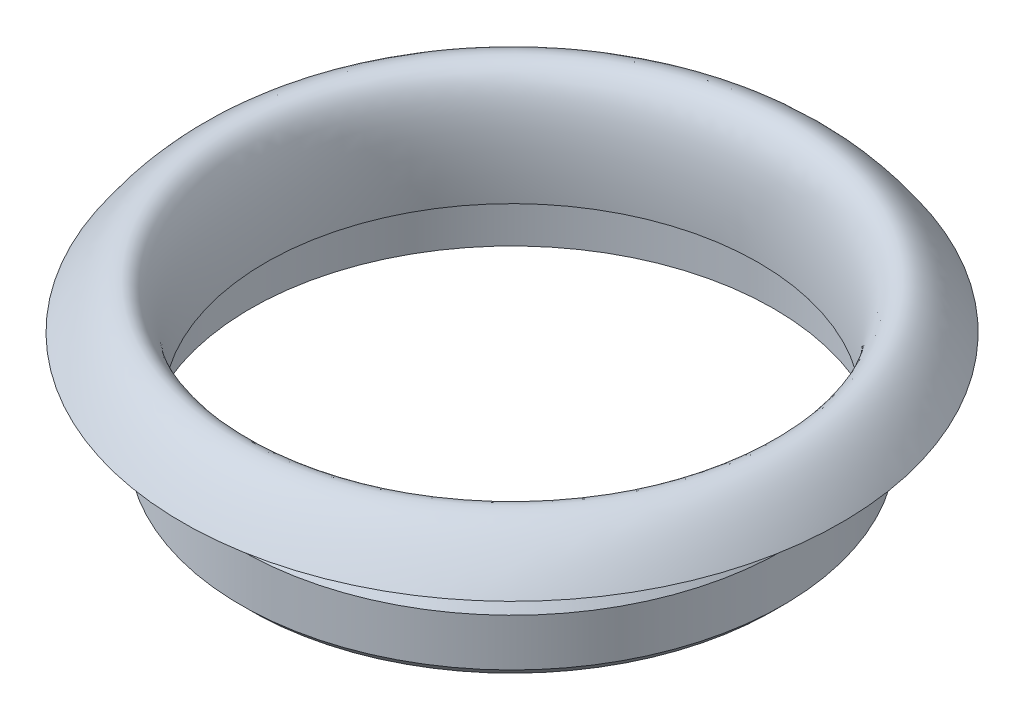
ISO-10303-21;
HEADER;
FILE_DESCRIPTION(('STEP AP214'),'2;1');
FILE_NAME('part.step','',(''),(''),'','','');
FILE_SCHEMA(('AUTOMOTIVE_DESIGN { 1 0 10303 214 1 1 1 1 }'));
ENDSEC;
DATA;
#1=APPLICATION_CONTEXT('core data for automotive mechanical design processes');
#2=APPLICATION_PROTOCOL_DEFINITION('international standard','automotive_design',2000,#1);
#3=PRODUCT_CONTEXT('',#1,'mechanical');
#4=PRODUCT('Part','Part','',(#3));
#5=PRODUCT_RELATED_PRODUCT_CATEGORY('part','',(#4));
#6=PRODUCT_DEFINITION_FORMATION('','',#4);
#7=PRODUCT_DEFINITION_CONTEXT('part definition',#1,'design');
#8=PRODUCT_DEFINITION('design','',#6,#7);
#9=PRODUCT_DEFINITION_SHAPE('','',#8);
#10=(LENGTH_UNIT() NAMED_UNIT(*) SI_UNIT(.MILLI.,.METRE.));
#11=(NAMED_UNIT(*) PLANE_ANGLE_UNIT() SI_UNIT($,.RADIAN.));
#12=(NAMED_UNIT(*) SI_UNIT($,.STERADIAN.) SOLID_ANGLE_UNIT());
#13=UNCERTAINTY_MEASURE_WITH_UNIT(LENGTH_MEASURE(1.E-05),#10,'distance_accuracy_value','');
#14=(GEOMETRIC_REPRESENTATION_CONTEXT(3) GLOBAL_UNCERTAINTY_ASSIGNED_CONTEXT((#13)) GLOBAL_UNIT_ASSIGNED_CONTEXT((#10,
#11,#12)) REPRESENTATION_CONTEXT('',''));
#15=CARTESIAN_POINT('',(0.,0.,0.));
#16=DIRECTION('',(0.,0.,1.));
#17=DIRECTION('',(1.,0.,0.));
#18=AXIS2_PLACEMENT_3D('',#15,#16,#17);
#19=CARTESIAN_POINT('',(-53.9197911218244,1.99998894248879,0.));
#20=CARTESIAN_POINT('',(-53.8973723331522,2.70253482728366,0.));
#21=CARTESIAN_POINT('',(-53.8669610528278,4.13823711393358,0.));
#22=CARTESIAN_POINT('',(-53.8719027555461,6.11175904762365,0.));
#23=CARTESIAN_POINT('',(-53.9236351386886,7.97753059977467,0.));
#24=CARTESIAN_POINT('',(-54.053631769709,10.2949520871215,0.));
#25=CARTESIAN_POINT('',(-54.3263594875917,12.8824376545672,0.));
#26=CARTESIAN_POINT('',(-54.9727004871494,16.3471177304074,0.));
#27=CARTESIAN_POINT('',(-55.8986720581001,18.770035909896,0.));
#28=CARTESIAN_POINT('',(-56.8833447435234,20.1055139825566,0.));
#29=CARTESIAN_POINT('',(-57.5434307134598,20.6165189133527,0.));
#30=CARTESIAN_POINT('',(-58.112865726207,20.8175999595448,0.));
#31=CARTESIAN_POINT('',(-58.8149639414059,20.8333481037732,0.));
#32=CARTESIAN_POINT('',(-59.8224273954332,20.5441829743244,0.));
#33=CARTESIAN_POINT('',(-61.1062671917436,19.8257080132769,0.));
#34=CARTESIAN_POINT('',(-62.5969346455263,18.6357233798375,0.));
#35=CARTESIAN_POINT('',(-64.2395644390793,16.9711555804732,0.));
#36=CARTESIAN_POINT('',(-65.711127705577,15.1844854037249,0.));
#37=CARTESIAN_POINT('',(-66.9255509224171,13.5373251129458,0.));
#38=CARTESIAN_POINT('',(-67.5646455106161,12.6102007961293,0.));
#39=CARTESIAN_POINT('',(-67.8703856300136,12.152912124841,0.));
#40=B_SPLINE_CURVE_WITH_KNOTS('',3,(#19,#20,#21,#22,#23,#24,#25,#26,#27,#28,#29,#30,#31,#32,#33,
#34,#35,#36,#37,#38,#39),.UNSPECIFIED.,.F.,.F.,(4,1,1,1,1,1,1,1,1,1,1,1,1,1,1,1,1,1,4),
(0.0260433266725054,0.0564794727139896,0.0869156187554738,0.117351764796958,0.147787910838442,
0.208660202921411,0.269532495004379,0.391277079170316,0.452149371253284,0.513021663336253,
0.573893955419221,0.63476624750219,0.695638539585158,0.756510831668126,0.817383123751095,
0.878255415834063,0.939127707917032,0.969563853958516,1.),.UNSPECIFIED.);
#41=CARTESIAN_POINT('',(0.,0.,0.));
#42=DIRECTION('',(0.,-1.,0.));
#43=AXIS1_PLACEMENT('',#41,#42);
#44=SURFACE_OF_REVOLUTION('',#40,#43);
#45=CARTESIAN_POINT('',(0.,12.152912124841,0.));
#46=DIRECTION('',(0.,-1.,0.));
#47=DIRECTION('',(0.,0.,-1.));
#48=AXIS2_PLACEMENT_3D('',#45,#46,#47);
#49=CIRCLE('',#48,67.8703856300136);
#50=CARTESIAN_POINT('',(0.,12.152912124841,-67.8703856300136));
#51=VERTEX_POINT('',#50);
#52=EDGE_CURVE('E62',#51,#51,#49,.T.);
#53=ORIENTED_EDGE('',*,*,#52,.T.);
#54=EDGE_LOOP('',(#53));
#55=FACE_BOUND('',#54,.T.);
#56=CARTESIAN_POINT('',(0.,7.32726743440723,0.));
#57=DIRECTION('',(0.,-1.,0.));
#58=DIRECTION('',(0.,0.,-1.));
#59=AXIS2_PLACEMENT_3D('',#56,#57,#58);
#60=CIRCLE('',#59,53.9082557865716);
#61=CARTESIAN_POINT('',(0.,7.32726743440723,-53.9082557865716));
#62=VERTEX_POINT('',#61);
#63=EDGE_CURVE('E10',#62,#62,#60,.T.);
#64=ORIENTED_EDGE('',*,*,#63,.F.);
#65=EDGE_LOOP('',(#64));
#66=FACE_BOUND('',#65,.T.);
#67=ADVANCED_FACE('F33',(#55,#66),#44,.F.);
#68=CARTESIAN_POINT('',(0.,1.99999999999999,0.));
#69=DIRECTION('',(0.,-1.,0.));
#70=DIRECTION('',(0.,0.,-1.));
#71=AXIS2_PLACEMENT_3D('',#68,#69,#70);
#72=CONICAL_SURFACE('',#71,57.2,0.553480884520044);
#73=ORIENTED_EDGE('',*,*,#63,.T.);
#74=EDGE_LOOP('',(#73));
#75=FACE_BOUND('',#74,.T.);
#76=CARTESIAN_POINT('',(0.,1.99999999999999,0.));
#77=DIRECTION('',(0.,-1.,0.));
#78=DIRECTION('',(0.,0.,-1.));
#79=AXIS2_PLACEMENT_3D('',#76,#77,#78);
#80=CIRCLE('',#79,57.2);
#81=CARTESIAN_POINT('',(0.,1.99999999999999,-57.2));
#82=VERTEX_POINT('',#81);
#83=EDGE_CURVE('E40',#82,#82,#80,.T.);
#84=ORIENTED_EDGE('',*,*,#83,.F.);
#85=EDGE_LOOP('',(#84));
#86=FACE_BOUND('',#85,.T.);
#87=ADVANCED_FACE('F95',(#75,#86),#72,.T.);
#88=CARTESIAN_POINT('',(0.,0.,0.));
#89=DIRECTION('',(0.,-1.,0.));
#90=DIRECTION('',(0.,0.,-1.));
#91=AXIS2_PLACEMENT_3D('',#88,#89,#90);
#92=CYLINDRICAL_SURFACE('',#91,57.2);
#93=CARTESIAN_POINT('',(0.,-7.99999999999998,0.));
#94=DIRECTION('',(0.,-1.,0.));
#95=DIRECTION('',(0.,0.,-1.));
#96=AXIS2_PLACEMENT_3D('',#93,#94,#95);
#97=CIRCLE('',#96,57.2);
#98=CARTESIAN_POINT('',(0.,-7.99999999999998,-57.2));
#99=VERTEX_POINT('',#98);
#100=EDGE_CURVE('E44',#99,#99,#97,.T.);
#101=ORIENTED_EDGE('',*,*,#100,.F.);
#102=EDGE_LOOP('',(#101));
#103=FACE_BOUND('',#102,.T.);
#104=ORIENTED_EDGE('',*,*,#83,.T.);
#105=EDGE_LOOP('',(#104));
#106=FACE_BOUND('',#105,.T.);
#107=ADVANCED_FACE('F92',(#103,#106),#92,.T.);
#108=CARTESIAN_POINT('',(0.,-10.,0.));
#109=DIRECTION('',(0.,1.,0.));
#110=DIRECTION('',(0.,0.,1.));
#111=AXIS2_PLACEMENT_3D('',#108,#109,#110);
#112=CONICAL_SURFACE('',#111,55.2,0.785398163397443);
#113=ORIENTED_EDGE('',*,*,#100,.T.);
#114=EDGE_LOOP('',(#113));
#115=FACE_BOUND('',#114,.T.);
#116=CARTESIAN_POINT('',(0.,-10.,0.));
#117=DIRECTION('',(0.,-1.,0.));
#118=DIRECTION('',(0.,0.,-1.));
#119=AXIS2_PLACEMENT_3D('',#116,#117,#118);
#120=CIRCLE('',#119,55.2);
#121=CARTESIAN_POINT('',(0.,-10.,-55.2));
#122=VERTEX_POINT('',#121);
#123=EDGE_CURVE('E48',#122,#122,#120,.T.);
#124=ORIENTED_EDGE('',*,*,#123,.F.);
#125=EDGE_LOOP('',(#124));
#126=FACE_BOUND('',#125,.T.);
#127=ADVANCED_FACE('F88',(#115,#126),#112,.T.);
#128=CARTESIAN_POINT('',(0.,0.,0.));
#129=DIRECTION('',(0.,-1.,0.));
#130=DIRECTION('',(0.,0.,-1.));
#131=AXIS2_PLACEMENT_3D('',#128,#129,#130);
#132=CYLINDRICAL_SURFACE('',#131,55.2);
#133=ORIENTED_EDGE('',*,*,#123,.T.);
#134=EDGE_LOOP('',(#133));
#135=FACE_BOUND('',#134,.T.);
#136=CARTESIAN_POINT('',(0.,0.,0.));
#137=DIRECTION('',(0.,-1.,0.));
#138=DIRECTION('',(0.,0.,-1.));
#139=AXIS2_PLACEMENT_3D('',#136,#137,#138);
#140=CIRCLE('',#139,55.2);
#141=CARTESIAN_POINT('',(0.,0.,-55.2));
#142=VERTEX_POINT('',#141);
#143=EDGE_CURVE('E53',#142,#142,#140,.T.);
#144=ORIENTED_EDGE('',*,*,#143,.F.);
#145=EDGE_LOOP('',(#144));
#146=FACE_BOUND('',#145,.T.);
#147=ADVANCED_FACE('F84',(#135,#146),#132,.F.);
#148=CARTESIAN_POINT('',(0.,0.,0.));
#149=DIRECTION('',(0.,-1.,0.));
#150=DIRECTION('',(0.,0.,-1.));
#151=AXIS2_PLACEMENT_3D('',#148,#149,#150);
#152=PLANE('',#151);
#153=ORIENTED_EDGE('',*,*,#143,.T.);
#154=EDGE_LOOP('',(#153));
#155=FACE_BOUND('',#154,.T.);
#156=CARTESIAN_POINT('',(0.,0.,0.));
#157=DIRECTION('',(0.,-1.,0.));
#158=DIRECTION('',(0.,0.,-1.));
#159=AXIS2_PLACEMENT_3D('',#156,#157,#158);
#160=CIRCLE('',#159,52.);
#161=CARTESIAN_POINT('',(0.,0.,-52.));
#162=VERTEX_POINT('',#161);
#163=EDGE_CURVE('E56',#162,#162,#160,.T.);
#164=ORIENTED_EDGE('',*,*,#163,.F.);
#165=EDGE_LOOP('',(#164));
#166=FACE_BOUND('',#165,.T.);
#167=ADVANCED_FACE('F80',(#155,#166),#152,.T.);
#168=CARTESIAN_POINT('',(-52.,0.,0.));
#169=CARTESIAN_POINT('',(-50.7454355095083,25.3387176987941,0.));
#170=CARTESIAN_POINT('',(-58.8221320893741,29.2845143343792,0.));
#171=CARTESIAN_POINT('',(-69.5330053790364,13.2645305711431,0.));
#172=B_SPLINE_CURVE_WITH_KNOTS('',3,(#168,#169,#170,#171),.UNSPECIFIED.,.F.,.F.,(4,4),(0.,1.),.UNSPECIFIED.);
#173=CARTESIAN_POINT('',(0.,0.,0.));
#174=DIRECTION('',(0.,-1.,0.));
#175=AXIS1_PLACEMENT('',#173,#174);
#176=SURFACE_OF_REVOLUTION('',#172,#175);
#177=CARTESIAN_POINT('',(0.,13.2645305711431,0.));
#178=DIRECTION('',(0.,-1.,0.));
#179=DIRECTION('',(0.,0.,-1.));
#180=AXIS2_PLACEMENT_3D('',#177,#178,#179);
#181=CIRCLE('',#180,69.5330053790364);
#182=CARTESIAN_POINT('',(0.,13.2645305711431,-69.5330053790364));
#183=VERTEX_POINT('',#182);
#184=EDGE_CURVE('E59',#183,#183,#181,.T.);
#185=ORIENTED_EDGE('',*,*,#184,.F.);
#186=EDGE_LOOP('',(#185));
#187=FACE_BOUND('',#186,.T.);
#188=ORIENTED_EDGE('',*,*,#163,.T.);
#189=EDGE_LOOP('',(#188));
#190=FACE_BOUND('',#189,.T.);
#191=ADVANCED_FACE('F75',(#187,#190),#176,.T.);
#192=CARTESIAN_POINT('',(0.,13.2645305711431,0.));
#193=DIRECTION('',(0.,1.,0.));
#194=DIRECTION('',(0.,0.,1.));
#195=AXIS2_PLACEMENT_3D('',#192,#193,#194);
#196=CONICAL_SURFACE('',#195,69.5330053790364,0.981460245649059);
#197=ORIENTED_EDGE('',*,*,#52,.F.);
#198=EDGE_LOOP('',(#197));
#199=FACE_BOUND('',#198,.T.);
#200=ORIENTED_EDGE('',*,*,#184,.T.);
#201=EDGE_LOOP('',(#200));
#202=FACE_BOUND('',#201,.T.);
#203=ADVANCED_FACE('F79',(#199,#202),#196,.T.);
#204=CLOSED_SHELL('',(#67,#87,#107,#127,#147,#167,#191,#203));
#205=MANIFOLD_SOLID_BREP('B2',#204);
#206=ADVANCED_BREP_SHAPE_REPRESENTATION('',(#18,#205),#14);
#207=SHAPE_DEFINITION_REPRESENTATION(#9,#206);
ENDSEC;
END-ISO-10303-21;
